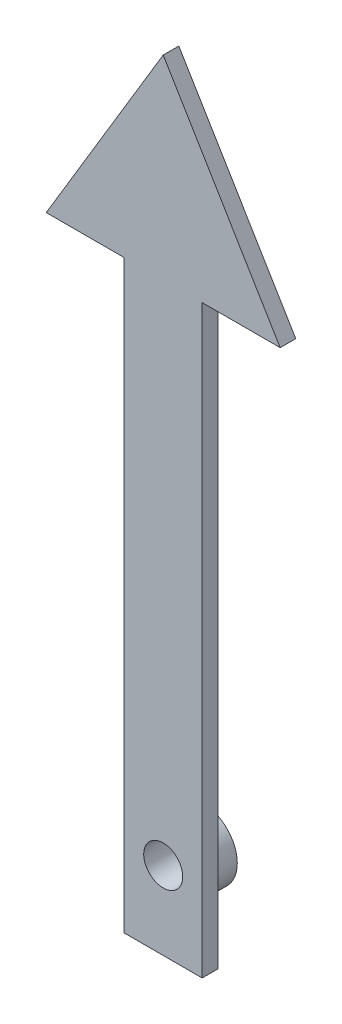
ISO-10303-21;
HEADER;
FILE_DESCRIPTION(('STEP AP214'),'2;1');
FILE_NAME('part.step','',(''),(''),'','','');
FILE_SCHEMA(('AUTOMOTIVE_DESIGN { 1 0 10303 214 1 1 1 1 }'));
ENDSEC;
DATA;
#1=APPLICATION_CONTEXT('core data for automotive mechanical design processes');
#2=APPLICATION_PROTOCOL_DEFINITION('international standard','automotive_design',2000,#1);
#3=PRODUCT_CONTEXT('',#1,'mechanical');
#4=PRODUCT('Part','Part','',(#3));
#5=PRODUCT_RELATED_PRODUCT_CATEGORY('part','',(#4));
#6=PRODUCT_DEFINITION_FORMATION('','',#4);
#7=PRODUCT_DEFINITION_CONTEXT('part definition',#1,'design');
#8=PRODUCT_DEFINITION('design','',#6,#7);
#9=PRODUCT_DEFINITION_SHAPE('','',#8);
#10=(LENGTH_UNIT() NAMED_UNIT(*) SI_UNIT(.MILLI.,.METRE.));
#11=(NAMED_UNIT(*) PLANE_ANGLE_UNIT() SI_UNIT($,.RADIAN.));
#12=(NAMED_UNIT(*) SI_UNIT($,.STERADIAN.) SOLID_ANGLE_UNIT());
#13=UNCERTAINTY_MEASURE_WITH_UNIT(LENGTH_MEASURE(1.E-05),#10,'distance_accuracy_value','');
#14=(GEOMETRIC_REPRESENTATION_CONTEXT(3) GLOBAL_UNCERTAINTY_ASSIGNED_CONTEXT((#13)) GLOBAL_UNIT_ASSIGNED_CONTEXT((#10,
#11,#12)) REPRESENTATION_CONTEXT('',''));
#15=CARTESIAN_POINT('',(0.,0.,0.));
#16=DIRECTION('',(0.,0.,1.));
#17=DIRECTION('',(1.,0.,0.));
#18=AXIS2_PLACEMENT_3D('',#15,#16,#17);
#19=CARTESIAN_POINT('',(3.81,19.05,0.508));
#20=DIRECTION('',(0.,1.,0.));
#21=DIRECTION('',(0.,0.,1.));
#22=AXIS2_PLACEMENT_3D('',#19,#20,#21);
#23=PLANE('',#22);
#24=DIRECTION('',(1.,0.,0.));
#25=VECTOR('',#24,1.);
#26=CARTESIAN_POINT('',(3.81,19.05,0.));
#27=LINE('',#26,#25);
#28=CARTESIAN_POINT('',(1.27,19.05,0.));
#29=VERTEX_POINT('',#28);
#30=CARTESIAN_POINT('',(3.81,19.05,0.));
#31=VERTEX_POINT('',#30);
#32=EDGE_CURVE('E139',#29,#31,#27,.T.);
#33=ORIENTED_EDGE('',*,*,#32,.T.);
#34=DIRECTION('',(0.,0.,-1.));
#35=VECTOR('',#34,1.);
#36=CARTESIAN_POINT('',(3.81,19.05,0.508));
#37=LINE('',#36,#35);
#38=CARTESIAN_POINT('',(3.81,19.05,0.508));
#39=VERTEX_POINT('',#38);
#40=EDGE_CURVE('E50',#39,#31,#37,.T.);
#41=ORIENTED_EDGE('',*,*,#40,.F.);
#42=DIRECTION('',(1.,0.,0.));
#43=VECTOR('',#42,1.);
#44=CARTESIAN_POINT('',(3.81,19.05,0.508));
#45=LINE('',#44,#43);
#46=CARTESIAN_POINT('',(1.27,19.05,0.508));
#47=VERTEX_POINT('',#46);
#48=EDGE_CURVE('E152',#47,#39,#45,.T.);
#49=ORIENTED_EDGE('',*,*,#48,.F.);
#50=DIRECTION('',(0.,0.,-1.));
#51=VECTOR('',#50,1.);
#52=CARTESIAN_POINT('',(1.27,19.05,0.508));
#53=LINE('',#52,#51);
#54=EDGE_CURVE('E135',#47,#29,#53,.T.);
#55=ORIENTED_EDGE('',*,*,#54,.T.);
#56=EDGE_LOOP('',(#33,#41,#49,#55));
#57=FACE_BOUND('',#56,.T.);
#58=ADVANCED_FACE('F47',(#57),#23,.F.);
#59=CARTESIAN_POINT('',(0.,25.4,0.508));
#60=DIRECTION('',(-0.857492925712544,-0.514495755427527,0.));
#61=DIRECTION('',(0.514495755427527,-0.857492925712544,0.));
#62=AXIS2_PLACEMENT_3D('',#59,#60,#61);
#63=PLANE('',#62);
#64=DIRECTION('',(-0.514495755427527,0.857492925712544,0.));
#65=VECTOR('',#64,1.);
#66=CARTESIAN_POINT('',(0.,25.4,0.));
#67=LINE('',#66,#65);
#68=CARTESIAN_POINT('',(0.,25.4,0.));
#69=VERTEX_POINT('',#68);
#70=EDGE_CURVE('E142',#31,#69,#67,.T.);
#71=ORIENTED_EDGE('',*,*,#70,.T.);
#72=DIRECTION('',(0.,0.,-1.));
#73=VECTOR('',#72,1.);
#74=CARTESIAN_POINT('',(0.,25.4,0.508));
#75=LINE('',#74,#73);
#76=CARTESIAN_POINT('',(0.,25.4,0.508));
#77=VERTEX_POINT('',#76);
#78=EDGE_CURVE('E158',#77,#69,#75,.T.);
#79=ORIENTED_EDGE('',*,*,#78,.F.);
#80=DIRECTION('',(-0.514495755427527,0.857492925712544,0.));
#81=VECTOR('',#80,1.);
#82=CARTESIAN_POINT('',(0.,25.4,0.508));
#83=LINE('',#82,#81);
#84=EDGE_CURVE('E105',#39,#77,#83,.T.);
#85=ORIENTED_EDGE('',*,*,#84,.F.);
#86=ORIENTED_EDGE('',*,*,#40,.T.);
#87=EDGE_LOOP('',(#71,#79,#85,#86));
#88=FACE_BOUND('',#87,.T.);
#89=ADVANCED_FACE('F164',(#88),#63,.F.);
#90=CARTESIAN_POINT('',(0.,25.4,0.508));
#91=DIRECTION('',(0.857492925712544,-0.514495755427527,0.));
#92=DIRECTION('',(0.514495755427527,0.857492925712544,0.));
#93=AXIS2_PLACEMENT_3D('',#90,#91,#92);
#94=PLANE('',#93);
#95=DIRECTION('',(-0.514495755427527,-0.857492925712544,0.));
#96=VECTOR('',#95,1.);
#97=CARTESIAN_POINT('',(0.,25.4,0.));
#98=LINE('',#97,#96);
#99=CARTESIAN_POINT('',(-3.81,19.05,0.));
#100=VERTEX_POINT('',#99);
#101=EDGE_CURVE('E145',#69,#100,#98,.T.);
#102=ORIENTED_EDGE('',*,*,#101,.T.);
#103=DIRECTION('',(0.,0.,-1.));
#104=VECTOR('',#103,1.);
#105=CARTESIAN_POINT('',(-3.81,19.05,0.508));
#106=LINE('',#105,#104);
#107=CARTESIAN_POINT('',(-3.81,19.05,0.508));
#108=VERTEX_POINT('',#107);
#109=EDGE_CURVE('E156',#108,#100,#106,.T.);
#110=ORIENTED_EDGE('',*,*,#109,.F.);
#111=DIRECTION('',(-0.514495755427527,-0.857492925712544,0.));
#112=VECTOR('',#111,1.);
#113=CARTESIAN_POINT('',(0.,25.4,0.508));
#114=LINE('',#113,#112);
#115=EDGE_CURVE('E175',#77,#108,#114,.T.);
#116=ORIENTED_EDGE('',*,*,#115,.F.);
#117=ORIENTED_EDGE('',*,*,#78,.T.);
#118=EDGE_LOOP('',(#102,#110,#116,#117));
#119=FACE_BOUND('',#118,.T.);
#120=ADVANCED_FACE('F172',(#119),#94,.F.);
#121=CARTESIAN_POINT('',(-3.81,19.05,0.508));
#122=DIRECTION('',(0.,1.,0.));
#123=DIRECTION('',(0.,0.,1.));
#124=AXIS2_PLACEMENT_3D('',#121,#122,#123);
#125=PLANE('',#124);
#126=DIRECTION('',(1.,0.,0.));
#127=VECTOR('',#126,1.);
#128=CARTESIAN_POINT('',(-3.81,19.05,0.));
#129=LINE('',#128,#127);
#130=CARTESIAN_POINT('',(-1.27,19.05,0.));
#131=VERTEX_POINT('',#130);
#132=EDGE_CURVE('E147',#100,#131,#129,.T.);
#133=ORIENTED_EDGE('',*,*,#132,.T.);
#134=DIRECTION('',(0.,0.,-1.));
#135=VECTOR('',#134,1.);
#136=CARTESIAN_POINT('',(-1.27,19.05,0.508));
#137=LINE('',#136,#135);
#138=CARTESIAN_POINT('',(-1.27,19.05,0.508));
#139=VERTEX_POINT('',#138);
#140=EDGE_CURVE('E130',#139,#131,#137,.T.);
#141=ORIENTED_EDGE('',*,*,#140,.F.);
#142=DIRECTION('',(1.,0.,0.));
#143=VECTOR('',#142,1.);
#144=CARTESIAN_POINT('',(-3.81,19.05,0.508));
#145=LINE('',#144,#143);
#146=EDGE_CURVE('E121',#108,#139,#145,.T.);
#147=ORIENTED_EDGE('',*,*,#146,.F.);
#148=ORIENTED_EDGE('',*,*,#109,.T.);
#149=EDGE_LOOP('',(#133,#141,#147,#148));
#150=FACE_BOUND('',#149,.T.);
#151=ADVANCED_FACE('F174',(#150),#125,.F.);
#152=CARTESIAN_POINT('',(-1.27,0.,0.508));
#153=DIRECTION('',(1.,0.,0.));
#154=DIRECTION('',(0.,0.,-1.));
#155=AXIS2_PLACEMENT_3D('',#152,#153,#154);
#156=PLANE('',#155);
#157=DIRECTION('',(0.,-1.,0.));
#158=VECTOR('',#157,1.);
#159=CARTESIAN_POINT('',(-1.27,0.,0.));
#160=LINE('',#159,#158);
#161=CARTESIAN_POINT('',(-1.27,0.,0.));
#162=VERTEX_POINT('',#161);
#163=EDGE_CURVE('E129',#131,#162,#160,.T.);
#164=ORIENTED_EDGE('',*,*,#163,.T.);
#165=DIRECTION('',(0.,0.,-1.));
#166=VECTOR('',#165,1.);
#167=CARTESIAN_POINT('',(-1.27,0.,0.508));
#168=LINE('',#167,#166);
#169=CARTESIAN_POINT('',(-1.27,0.,0.508));
#170=VERTEX_POINT('',#169);
#171=EDGE_CURVE('E126',#170,#162,#168,.T.);
#172=ORIENTED_EDGE('',*,*,#171,.F.);
#173=DIRECTION('',(0.,-1.,0.));
#174=VECTOR('',#173,1.);
#175=CARTESIAN_POINT('',(-1.27,0.,0.508));
#176=LINE('',#175,#174);
#177=EDGE_CURVE('E115',#139,#170,#176,.T.);
#178=ORIENTED_EDGE('',*,*,#177,.F.);
#179=ORIENTED_EDGE('',*,*,#140,.T.);
#180=EDGE_LOOP('',(#164,#172,#178,#179));
#181=FACE_BOUND('',#180,.T.);
#182=ADVANCED_FACE('F127',(#181),#156,.F.);
#183=CARTESIAN_POINT('',(1.27,0.,0.508));
#184=DIRECTION('',(0.,1.,0.));
#185=DIRECTION('',(0.,0.,1.));
#186=AXIS2_PLACEMENT_3D('',#183,#184,#185);
#187=PLANE('',#186);
#188=DIRECTION('',(1.,0.,0.));
#189=VECTOR('',#188,1.);
#190=CARTESIAN_POINT('',(1.27,0.,0.));
#191=LINE('',#190,#189);
#192=CARTESIAN_POINT('',(1.27,0.,0.));
#193=VERTEX_POINT('',#192);
#194=EDGE_CURVE('E90',#162,#193,#191,.T.);
#195=ORIENTED_EDGE('',*,*,#194,.T.);
#196=DIRECTION('',(0.,0.,-1.));
#197=VECTOR('',#196,1.);
#198=CARTESIAN_POINT('',(1.27,0.,0.508));
#199=LINE('',#198,#197);
#200=CARTESIAN_POINT('',(1.27,0.,0.508));
#201=VERTEX_POINT('',#200);
#202=EDGE_CURVE('E131',#201,#193,#199,.T.);
#203=ORIENTED_EDGE('',*,*,#202,.F.);
#204=DIRECTION('',(1.,0.,0.));
#205=VECTOR('',#204,1.);
#206=CARTESIAN_POINT('',(1.27,0.,0.508));
#207=LINE('',#206,#205);
#208=EDGE_CURVE('E119',#170,#201,#207,.T.);
#209=ORIENTED_EDGE('',*,*,#208,.F.);
#210=ORIENTED_EDGE('',*,*,#171,.T.);
#211=EDGE_LOOP('',(#195,#203,#209,#210));
#212=FACE_BOUND('',#211,.T.);
#213=ADVANCED_FACE('F133',(#212),#187,.F.);
#214=CARTESIAN_POINT('',(1.27,0.,0.508));
#215=DIRECTION('',(-1.,0.,0.));
#216=DIRECTION('',(0.,0.,1.));
#217=AXIS2_PLACEMENT_3D('',#214,#215,#216);
#218=PLANE('',#217);
#219=DIRECTION('',(0.,1.,0.));
#220=VECTOR('',#219,1.);
#221=CARTESIAN_POINT('',(1.27,0.,0.));
#222=LINE('',#221,#220);
#223=EDGE_CURVE('E96',#193,#29,#222,.T.);
#224=ORIENTED_EDGE('',*,*,#223,.T.);
#225=ORIENTED_EDGE('',*,*,#54,.F.);
#226=DIRECTION('',(0.,1.,0.));
#227=VECTOR('',#226,1.);
#228=CARTESIAN_POINT('',(1.27,0.,0.508));
#229=LINE('',#228,#227);
#230=EDGE_CURVE('E64',#201,#47,#229,.T.);
#231=ORIENTED_EDGE('',*,*,#230,.F.);
#232=ORIENTED_EDGE('',*,*,#202,.T.);
#233=EDGE_LOOP('',(#224,#225,#231,#232));
#234=FACE_BOUND('',#233,.T.);
#235=ADVANCED_FACE('F219',(#234),#218,.F.);
#236=CARTESIAN_POINT('',(0.,0.,0.508));
#237=DIRECTION('',(0.,0.,-1.));
#238=DIRECTION('',(-1.,0.,0.));
#239=AXIS2_PLACEMENT_3D('',#236,#237,#238);
#240=PLANE('',#239);
#241=CARTESIAN_POINT('',(0.,2.54,0.508));
#242=DIRECTION('',(0.,0.,1.));
#243=DIRECTION('',(1.,0.,0.));
#244=AXIS2_PLACEMENT_3D('',#241,#242,#243);
#245=CIRCLE('',#244,0.635);
#246=CARTESIAN_POINT('',(0.635,2.54,0.508));
#247=VERTEX_POINT('',#246);
#248=EDGE_CURVE('E143',#247,#247,#245,.T.);
#249=ORIENTED_EDGE('',*,*,#248,.F.);
#250=EDGE_LOOP('',(#249));
#251=FACE_BOUND('',#250,.T.);
#252=ORIENTED_EDGE('',*,*,#48,.T.);
#253=ORIENTED_EDGE('',*,*,#84,.T.);
#254=ORIENTED_EDGE('',*,*,#115,.T.);
#255=ORIENTED_EDGE('',*,*,#146,.T.);
#256=ORIENTED_EDGE('',*,*,#177,.T.);
#257=ORIENTED_EDGE('',*,*,#208,.T.);
#258=ORIENTED_EDGE('',*,*,#230,.T.);
#259=EDGE_LOOP('',(#252,#253,#254,#255,#256,#257,#258));
#260=FACE_BOUND('',#259,.T.);
#261=ADVANCED_FACE('F117',(#251,#260),#240,.F.);
#262=CARTESIAN_POINT('',(0.,0.,0.));
#263=DIRECTION('',(0.,0.,-1.));
#264=DIRECTION('',(-1.,0.,0.));
#265=AXIS2_PLACEMENT_3D('',#262,#263,#264);
#266=PLANE('',#265);
#267=CARTESIAN_POINT('',(0.,2.54,0.));
#268=DIRECTION('',(0.,0.,-1.));
#269=DIRECTION('',(-1.,0.,0.));
#270=AXIS2_PLACEMENT_3D('',#267,#268,#269);
#271=CIRCLE('',#270,1.143);
#272=CARTESIAN_POINT('',(1.143,2.54,0.));
#273=VERTEX_POINT('',#272);
#274=EDGE_CURVE('E11',#273,#273,#271,.T.);
#275=ORIENTED_EDGE('',*,*,#274,.F.);
#276=EDGE_LOOP('',(#275));
#277=FACE_BOUND('',#276,.T.);
#278=ORIENTED_EDGE('',*,*,#32,.F.);
#279=ORIENTED_EDGE('',*,*,#223,.F.);
#280=ORIENTED_EDGE('',*,*,#194,.F.);
#281=ORIENTED_EDGE('',*,*,#163,.F.);
#282=ORIENTED_EDGE('',*,*,#132,.F.);
#283=ORIENTED_EDGE('',*,*,#101,.F.);
#284=ORIENTED_EDGE('',*,*,#70,.F.);
#285=EDGE_LOOP('',(#278,#279,#280,#281,#282,#283,#284));
#286=FACE_BOUND('',#285,.T.);
#287=ADVANCED_FACE('F169',(#277,#286),#266,.T.);
#288=CARTESIAN_POINT('',(0.,2.54,0.));
#289=DIRECTION('',(0.,0.,1.));
#290=DIRECTION('',(1.,0.,0.));
#291=AXIS2_PLACEMENT_3D('',#288,#289,#290);
#292=CYLINDRICAL_SURFACE('',#291,0.635);
#293=ORIENTED_EDGE('',*,*,#248,.T.);
#294=EDGE_LOOP('',(#293));
#295=FACE_BOUND('',#294,.T.);
#296=CARTESIAN_POINT('',(0.,2.54,-0.762));
#297=DIRECTION('',(0.,0.,-1.));
#298=DIRECTION('',(-1.,0.,0.));
#299=AXIS2_PLACEMENT_3D('',#296,#297,#298);
#300=CIRCLE('',#299,0.635);
#301=CARTESIAN_POINT('',(-0.635,2.54,-0.762));
#302=VERTEX_POINT('',#301);
#303=EDGE_CURVE('E185',#302,#302,#300,.T.);
#304=ORIENTED_EDGE('',*,*,#303,.T.);
#305=EDGE_LOOP('',(#304));
#306=FACE_BOUND('',#305,.T.);
#307=ADVANCED_FACE('F189',(#295,#306),#292,.F.);
#308=CARTESIAN_POINT('',(0.,2.54,-0.762));
#309=DIRECTION('',(0.,0.,-1.));
#310=DIRECTION('',(-1.,0.,0.));
#311=AXIS2_PLACEMENT_3D('',#308,#309,#310);
#312=PLANE('',#311);
#313=CARTESIAN_POINT('',(0.,2.54,-0.762));
#314=DIRECTION('',(0.,0.,-1.));
#315=DIRECTION('',(-1.,0.,0.));
#316=AXIS2_PLACEMENT_3D('',#313,#314,#315);
#317=CIRCLE('',#316,1.143);
#318=CARTESIAN_POINT('',(1.143,2.54,-0.762));
#319=VERTEX_POINT('',#318);
#320=EDGE_CURVE('E181',#319,#319,#317,.T.);
#321=ORIENTED_EDGE('',*,*,#320,.T.);
#322=EDGE_LOOP('',(#321));
#323=FACE_BOUND('',#322,.T.);
#324=ORIENTED_EDGE('',*,*,#303,.F.);
#325=EDGE_LOOP('',(#324));
#326=FACE_BOUND('',#325,.T.);
#327=ADVANCED_FACE('F191',(#323,#326),#312,.T.);
#328=CARTESIAN_POINT('',(0.,2.54,-0.762));
#329=DIRECTION('',(0.,0.,1.));
#330=DIRECTION('',(1.,0.,0.));
#331=AXIS2_PLACEMENT_3D('',#328,#329,#330);
#332=CYLINDRICAL_SURFACE('',#331,1.143);
#333=CARTESIAN_POINT('',(1.143,2.54,-0.762));
#334=CARTESIAN_POINT('',(1.143,2.54,-0.7540625));
#335=CARTESIAN_POINT('',(1.143,2.54,-0.746125));
#336=CARTESIAN_POINT('',(1.143,2.54,-0.73025));
#337=CARTESIAN_POINT('',(1.143,2.54,-0.7223125));
#338=CARTESIAN_POINT('',(1.143,2.54,-0.7064375));
#339=CARTESIAN_POINT('',(1.143,2.54,-0.6985));
#340=CARTESIAN_POINT('',(1.143,2.54,-0.682625));
#341=CARTESIAN_POINT('',(1.143,2.54,-0.6746875));
#342=CARTESIAN_POINT('',(1.143,2.54,-0.6588125));
#343=CARTESIAN_POINT('',(1.143,2.54,-0.650875));
#344=CARTESIAN_POINT('',(1.143,2.54,-0.635));
#345=CARTESIAN_POINT('',(1.143,2.54,-0.6270625));
#346=CARTESIAN_POINT('',(1.143,2.54,-0.6111875));
#347=CARTESIAN_POINT('',(1.143,2.54,-0.60325));
#348=CARTESIAN_POINT('',(1.143,2.54,-0.587375));
#349=CARTESIAN_POINT('',(1.143,2.54,-0.5794375));
#350=CARTESIAN_POINT('',(1.143,2.54,-0.5635625));
#351=CARTESIAN_POINT('',(1.143,2.54,-0.555625));
#352=CARTESIAN_POINT('',(1.143,2.54,-0.53975));
#353=CARTESIAN_POINT('',(1.143,2.54,-0.5318125));
#354=CARTESIAN_POINT('',(1.143,2.54,-0.5159375));
#355=CARTESIAN_POINT('',(1.143,2.54,-0.508));
#356=CARTESIAN_POINT('',(1.143,2.54,-0.492125));
#357=CARTESIAN_POINT('',(1.143,2.54,-0.4841875));
#358=CARTESIAN_POINT('',(1.143,2.54,-0.4683125));
#359=CARTESIAN_POINT('',(1.143,2.54,-0.460375));
#360=CARTESIAN_POINT('',(1.143,2.54,-0.4445));
#361=CARTESIAN_POINT('',(1.143,2.54,-0.4365625));
#362=CARTESIAN_POINT('',(1.143,2.54,-0.4206875));
#363=CARTESIAN_POINT('',(1.143,2.54,-0.41275));
#364=CARTESIAN_POINT('',(1.143,2.54,-0.396875));
#365=CARTESIAN_POINT('',(1.143,2.54,-0.3889375));
#366=CARTESIAN_POINT('',(1.143,2.54,-0.3730625));
#367=CARTESIAN_POINT('',(1.143,2.54,-0.365125));
#368=CARTESIAN_POINT('',(1.143,2.54,-0.34925));
#369=CARTESIAN_POINT('',(1.143,2.54,-0.3413125));
#370=CARTESIAN_POINT('',(1.143,2.54,-0.3254375));
#371=CARTESIAN_POINT('',(1.143,2.54,-0.3175));
#372=CARTESIAN_POINT('',(1.143,2.54,-0.301625));
#373=CARTESIAN_POINT('',(1.143,2.54,-0.2936875));
#374=CARTESIAN_POINT('',(1.143,2.54,-0.2778125));
#375=CARTESIAN_POINT('',(1.143,2.54,-0.269875));
#376=CARTESIAN_POINT('',(1.143,2.54,-0.254));
#377=CARTESIAN_POINT('',(1.143,2.54,-0.2460625));
#378=CARTESIAN_POINT('',(1.143,2.54,-0.2301875));
#379=CARTESIAN_POINT('',(1.143,2.54,-0.22225));
#380=CARTESIAN_POINT('',(1.143,2.54,-0.206375));
#381=CARTESIAN_POINT('',(1.143,2.54,-0.1984375));
#382=CARTESIAN_POINT('',(1.143,2.54,-0.1825625));
#383=CARTESIAN_POINT('',(1.143,2.54,-0.174625));
#384=CARTESIAN_POINT('',(1.143,2.54,-0.15875));
#385=CARTESIAN_POINT('',(1.143,2.54,-0.1508125));
#386=CARTESIAN_POINT('',(1.143,2.54,-0.1349375));
#387=CARTESIAN_POINT('',(1.143,2.54,-0.127));
#388=CARTESIAN_POINT('',(1.143,2.54,-0.111125));
#389=CARTESIAN_POINT('',(1.143,2.54,-0.1031875));
#390=CARTESIAN_POINT('',(1.143,2.54,-0.0873125));
#391=CARTESIAN_POINT('',(1.143,2.54,-0.079375));
#392=CARTESIAN_POINT('',(1.143,2.54,-0.0635));
#393=CARTESIAN_POINT('',(1.143,2.54,-0.0555625));
#394=CARTESIAN_POINT('',(1.143,2.54,-0.0396875));
#395=CARTESIAN_POINT('',(1.143,2.54,-0.03175));
#396=CARTESIAN_POINT('',(1.143,2.54,-0.015875));
#397=CARTESIAN_POINT('',(1.143,2.54,-0.00793749999999999));
#398=CARTESIAN_POINT('',(1.143,2.54,0.));
#399=B_SPLINE_CURVE_WITH_KNOTS('',3,(#333,#334,#335,#336,#337,#338,#339,#340,#341,#342,#343,
#344,#345,#346,#347,#348,#349,#350,#351,#352,#353,#354,#355,#356,#357,#358,#359,#360,#361,#362,
#363,#364,#365,#366,#367,#368,#369,#370,#371,#372,#373,#374,#375,#376,#377,#378,#379,#380,#381,
#382,#383,#384,#385,#386,#387,#388,#389,#390,#391,#392,#393,#394,#395,#396,#397,#398),
.UNSPECIFIED.,.F.,.F.,(4,2,2,2,2,2,2,2,2,2,2,2,2,2,2,2,2,2,2,2,2,2,2,2,2,2,2,2,2,2,2,2,4),(0.,
0.0238125,0.0476249999999999,0.0714374999999999,0.09525,0.1190625,0.142875,0.1666875,0.1905,
0.2143125,0.238125,0.2619375,0.28575,0.3095625,0.333375,0.3571875,0.381,0.4048125,0.428625,
0.4524375,0.47625,0.5000625,0.523875,0.5476875,0.5715,0.5953125,0.619125,0.6429375,0.66675,
0.6905625,0.714375,0.7381875,0.762),.UNSPECIFIED.);
#400=EDGE_CURVE('BSEAM193',#319,#273,#399,.T.);
#401=ORIENTED_EDGE('',*,*,#320,.F.);
#402=ORIENTED_EDGE('',*,*,#274,.T.);
#403=ORIENTED_EDGE('',*,*,#400,.T.);
#404=ORIENTED_EDGE('',*,*,#400,.F.);
#405=EDGE_LOOP('',(#401,#403,#402,#404));
#406=FACE_BOUND('',#405,.T.);
#407=ADVANCED_FACE('F193',(#406),#332,.T.);
#408=CLOSED_SHELL('',(#58,#89,#120,#151,#182,#213,#235,#261,#287,#307,#327,#407));
#409=MANIFOLD_SOLID_BREP('B2',#408);
#410=ADVANCED_BREP_SHAPE_REPRESENTATION('',(#18,#409),#14);
#411=SHAPE_DEFINITION_REPRESENTATION(#9,#410);
ENDSEC;
END-ISO-10303-21;
